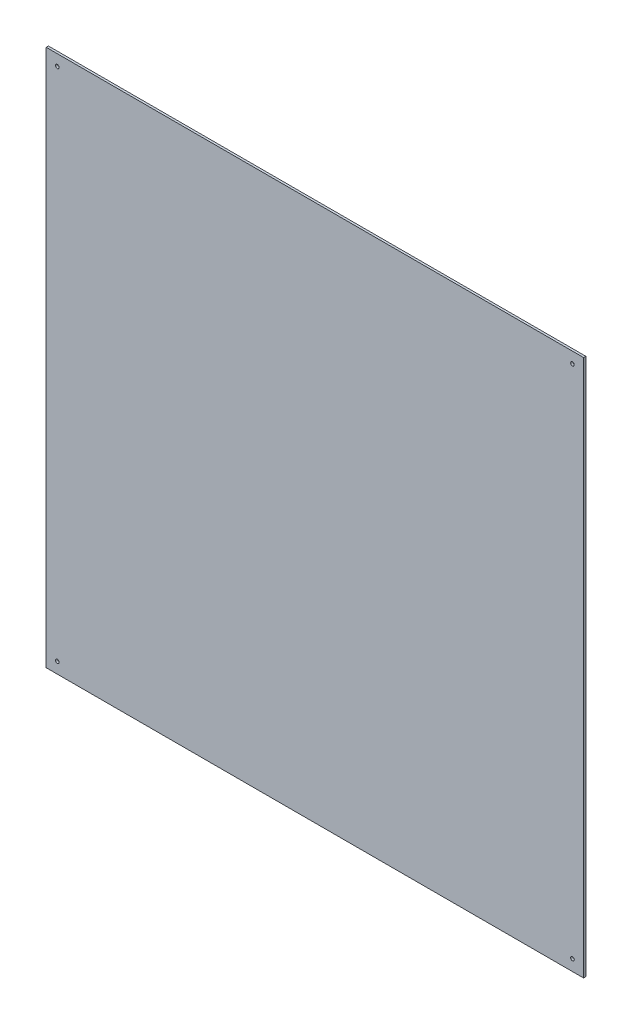
ISO-10303-21;
HEADER;
FILE_DESCRIPTION(('STEP AP214'),'2;1');
FILE_NAME('part.step','',(''),(''),'','','');
FILE_SCHEMA(('AUTOMOTIVE_DESIGN { 1 0 10303 214 1 1 1 1 }'));
ENDSEC;
DATA;
#1=APPLICATION_CONTEXT('core data for automotive mechanical design processes');
#2=APPLICATION_PROTOCOL_DEFINITION('international standard','automotive_design',2000,#1);
#3=PRODUCT_CONTEXT('',#1,'mechanical');
#4=PRODUCT('Part','Part','',(#3));
#5=PRODUCT_RELATED_PRODUCT_CATEGORY('part','',(#4));
#6=PRODUCT_DEFINITION_FORMATION('','',#4);
#7=PRODUCT_DEFINITION_CONTEXT('part definition',#1,'design');
#8=PRODUCT_DEFINITION('design','',#6,#7);
#9=PRODUCT_DEFINITION_SHAPE('','',#8);
#10=(LENGTH_UNIT() NAMED_UNIT(*) SI_UNIT(.MILLI.,.METRE.));
#11=(NAMED_UNIT(*) PLANE_ANGLE_UNIT() SI_UNIT($,.RADIAN.));
#12=(NAMED_UNIT(*) SI_UNIT($,.STERADIAN.) SOLID_ANGLE_UNIT());
#13=UNCERTAINTY_MEASURE_WITH_UNIT(LENGTH_MEASURE(1.E-05),#10,'distance_accuracy_value','');
#14=(GEOMETRIC_REPRESENTATION_CONTEXT(3) GLOBAL_UNCERTAINTY_ASSIGNED_CONTEXT((#13)) GLOBAL_UNIT_ASSIGNED_CONTEXT((#10,
#11,#12)) REPRESENTATION_CONTEXT('',''));
#15=CARTESIAN_POINT('',(0.,0.,0.));
#16=DIRECTION('',(0.,0.,1.));
#17=DIRECTION('',(1.,0.,0.));
#18=AXIS2_PLACEMENT_3D('',#15,#16,#17);
#19=CARTESIAN_POINT('',(-579.999999999999,-580.,0.));
#20=DIRECTION('',(0.,0.,1.));
#21=DIRECTION('',(1.,0.,0.));
#22=AXIS2_PLACEMENT_3D('',#19,#20,#21);
#23=CYLINDRICAL_SURFACE('',#22,4.05000000000001);
#24=CARTESIAN_POINT('',(-579.999999999999,-580.,0.));
#25=DIRECTION('',(0.,0.,1.));
#26=DIRECTION('',(1.,0.,0.));
#27=AXIS2_PLACEMENT_3D('',#24,#25,#26);
#28=CIRCLE('',#27,4.05000000000001);
#29=CARTESIAN_POINT('',(-575.949999999999,-580.,0.));
#30=VERTEX_POINT('',#29);
#31=EDGE_CURVE('E43',#30,#30,#28,.T.);
#32=ORIENTED_EDGE('',*,*,#31,.F.);
#33=EDGE_LOOP('',(#32));
#34=FACE_BOUND('',#33,.T.);
#35=CARTESIAN_POINT('',(-579.999999999999,-580.,5.));
#36=DIRECTION('',(0.,0.,1.));
#37=DIRECTION('',(1.,0.,0.));
#38=AXIS2_PLACEMENT_3D('',#35,#36,#37);
#39=CIRCLE('',#38,4.05000000000001);
#40=CARTESIAN_POINT('',(-575.949999999999,-580.,5.));
#41=VERTEX_POINT('',#40);
#42=EDGE_CURVE('E11',#41,#41,#39,.T.);
#43=ORIENTED_EDGE('',*,*,#42,.T.);
#44=EDGE_LOOP('',(#43));
#45=FACE_BOUND('',#44,.T.);
#46=ADVANCED_FACE('F35',(#34,#45),#23,.F.);
#47=CARTESIAN_POINT('',(580.000000000001,-580.,0.));
#48=DIRECTION('',(0.,0.,1.));
#49=DIRECTION('',(1.,0.,0.));
#50=AXIS2_PLACEMENT_3D('',#47,#48,#49);
#51=CYLINDRICAL_SURFACE('',#50,4.05000000000001);
#52=CARTESIAN_POINT('',(580.000000000001,-580.,0.));
#53=DIRECTION('',(0.,0.,1.));
#54=DIRECTION('',(1.,0.,0.));
#55=AXIS2_PLACEMENT_3D('',#52,#53,#54);
#56=CIRCLE('',#55,4.05000000000001);
#57=CARTESIAN_POINT('',(584.050000000001,-580.,0.));
#58=VERTEX_POINT('',#57);
#59=EDGE_CURVE('E113',#58,#58,#56,.T.);
#60=ORIENTED_EDGE('',*,*,#59,.F.);
#61=EDGE_LOOP('',(#60));
#62=FACE_BOUND('',#61,.T.);
#63=CARTESIAN_POINT('',(580.000000000001,-580.,5.));
#64=DIRECTION('',(0.,0.,1.));
#65=DIRECTION('',(1.,0.,0.));
#66=AXIS2_PLACEMENT_3D('',#63,#64,#65);
#67=CIRCLE('',#66,4.05000000000001);
#68=CARTESIAN_POINT('',(584.050000000001,-580.,5.));
#69=VERTEX_POINT('',#68);
#70=EDGE_CURVE('E116',#69,#69,#67,.T.);
#71=ORIENTED_EDGE('',*,*,#70,.T.);
#72=EDGE_LOOP('',(#71));
#73=FACE_BOUND('',#72,.T.);
#74=ADVANCED_FACE('F125',(#62,#73),#51,.F.);
#75=CARTESIAN_POINT('',(-605.,605.,5.));
#76=DIRECTION('',(1.,0.,0.));
#77=DIRECTION('',(0.,0.,-1.));
#78=AXIS2_PLACEMENT_3D('',#75,#76,#77);
#79=PLANE('',#78);
#80=DIRECTION('',(0.,-1.,0.));
#81=VECTOR('',#80,1.);
#82=CARTESIAN_POINT('',(-605.,605.,0.));
#83=LINE('',#82,#81);
#84=CARTESIAN_POINT('',(-605.,605.,0.));
#85=VERTEX_POINT('',#84);
#86=CARTESIAN_POINT('',(-605.,-605.,0.));
#87=VERTEX_POINT('',#86);
#88=EDGE_CURVE('E103',#85,#87,#83,.T.);
#89=ORIENTED_EDGE('',*,*,#88,.T.);
#90=DIRECTION('',(0.,0.,-1.));
#91=VECTOR('',#90,1.);
#92=CARTESIAN_POINT('',(-605.,-605.,5.));
#93=LINE('',#92,#91);
#94=CARTESIAN_POINT('',(-605.,-605.,5.));
#95=VERTEX_POINT('',#94);
#96=EDGE_CURVE('E94',#95,#87,#93,.T.);
#97=ORIENTED_EDGE('',*,*,#96,.F.);
#98=DIRECTION('',(0.,-1.,0.));
#99=VECTOR('',#98,1.);
#100=CARTESIAN_POINT('',(-605.,605.,5.));
#101=LINE('',#100,#99);
#102=CARTESIAN_POINT('',(-605.,605.,5.));
#103=VERTEX_POINT('',#102);
#104=EDGE_CURVE('E88',#103,#95,#101,.T.);
#105=ORIENTED_EDGE('',*,*,#104,.F.);
#106=DIRECTION('',(0.,0.,-1.));
#107=VECTOR('',#106,1.);
#108=CARTESIAN_POINT('',(-605.,605.,5.));
#109=LINE('',#108,#107);
#110=EDGE_CURVE('E99',#103,#85,#109,.T.);
#111=ORIENTED_EDGE('',*,*,#110,.T.);
#112=EDGE_LOOP('',(#89,#97,#105,#111));
#113=FACE_BOUND('',#112,.T.);
#114=ADVANCED_FACE('F149',(#113),#79,.F.);
#115=CARTESIAN_POINT('',(-605.,-605.,5.));
#116=DIRECTION('',(0.,1.,0.));
#117=DIRECTION('',(-1.,0.,0.));
#118=AXIS2_PLACEMENT_3D('',#115,#116,#117);
#119=PLANE('',#118);
#120=DIRECTION('',(1.,0.,0.));
#121=VECTOR('',#120,1.);
#122=CARTESIAN_POINT('',(-605.,-605.,0.));
#123=LINE('',#122,#121);
#124=CARTESIAN_POINT('',(605.,-605.,0.));
#125=VERTEX_POINT('',#124);
#126=EDGE_CURVE('E93',#87,#125,#123,.T.);
#127=ORIENTED_EDGE('',*,*,#126,.T.);
#128=DIRECTION('',(0.,0.,-1.));
#129=VECTOR('',#128,1.);
#130=CARTESIAN_POINT('',(605.,-605.,5.));
#131=LINE('',#130,#129);
#132=CARTESIAN_POINT('',(605.,-605.,5.));
#133=VERTEX_POINT('',#132);
#134=EDGE_CURVE('E91',#133,#125,#131,.T.);
#135=ORIENTED_EDGE('',*,*,#134,.F.);
#136=DIRECTION('',(1.,0.,0.));
#137=VECTOR('',#136,1.);
#138=CARTESIAN_POINT('',(-605.,-605.,5.));
#139=LINE('',#138,#137);
#140=EDGE_CURVE('E82',#95,#133,#139,.T.);
#141=ORIENTED_EDGE('',*,*,#140,.F.);
#142=ORIENTED_EDGE('',*,*,#96,.T.);
#143=EDGE_LOOP('',(#127,#135,#141,#142));
#144=FACE_BOUND('',#143,.T.);
#145=ADVANCED_FACE('F92',(#144),#119,.F.);
#146=CARTESIAN_POINT('',(605.,605.,5.));
#147=DIRECTION('',(-1.,0.,0.));
#148=DIRECTION('',(0.,-1.,0.));
#149=AXIS2_PLACEMENT_3D('',#146,#147,#148);
#150=PLANE('',#149);
#151=DIRECTION('',(0.,1.,0.));
#152=VECTOR('',#151,1.);
#153=CARTESIAN_POINT('',(605.,605.,0.));
#154=LINE('',#153,#152);
#155=CARTESIAN_POINT('',(605.,605.,0.));
#156=VERTEX_POINT('',#155);
#157=EDGE_CURVE('E68',#125,#156,#154,.T.);
#158=ORIENTED_EDGE('',*,*,#157,.T.);
#159=DIRECTION('',(0.,0.,-1.));
#160=VECTOR('',#159,1.);
#161=CARTESIAN_POINT('',(605.,605.,5.));
#162=LINE('',#161,#160);
#163=CARTESIAN_POINT('',(605.,605.,5.));
#164=VERTEX_POINT('',#163);
#165=EDGE_CURVE('E95',#164,#156,#162,.T.);
#166=ORIENTED_EDGE('',*,*,#165,.F.);
#167=DIRECTION('',(0.,1.,0.));
#168=VECTOR('',#167,1.);
#169=CARTESIAN_POINT('',(605.,605.,5.));
#170=LINE('',#169,#168);
#171=EDGE_CURVE('E86',#133,#164,#170,.T.);
#172=ORIENTED_EDGE('',*,*,#171,.F.);
#173=ORIENTED_EDGE('',*,*,#134,.T.);
#174=EDGE_LOOP('',(#158,#166,#172,#173));
#175=FACE_BOUND('',#174,.T.);
#176=ADVANCED_FACE('F97',(#175),#150,.F.);
#177=CARTESIAN_POINT('',(-605.,605.,5.));
#178=DIRECTION('',(0.,-1.,0.));
#179=DIRECTION('',(1.,0.,0.));
#180=AXIS2_PLACEMENT_3D('',#177,#178,#179);
#181=PLANE('',#180);
#182=DIRECTION('',(-1.,0.,0.));
#183=VECTOR('',#182,1.);
#184=CARTESIAN_POINT('',(-605.,605.,0.));
#185=LINE('',#184,#183);
#186=EDGE_CURVE('E74',#156,#85,#185,.T.);
#187=ORIENTED_EDGE('',*,*,#186,.T.);
#188=ORIENTED_EDGE('',*,*,#110,.F.);
#189=DIRECTION('',(-1.,0.,0.));
#190=VECTOR('',#189,1.);
#191=CARTESIAN_POINT('',(-605.,605.,5.));
#192=LINE('',#191,#190);
#193=EDGE_CURVE('E51',#164,#103,#192,.T.);
#194=ORIENTED_EDGE('',*,*,#193,.F.);
#195=ORIENTED_EDGE('',*,*,#165,.T.);
#196=EDGE_LOOP('',(#187,#188,#194,#195));
#197=FACE_BOUND('',#196,.T.);
#198=ADVANCED_FACE('F129',(#197),#181,.F.);
#199=CARTESIAN_POINT('',(0.,0.,5.));
#200=DIRECTION('',(0.,0.,1.));
#201=DIRECTION('',(1.,0.,0.));
#202=AXIS2_PLACEMENT_3D('',#199,#200,#201);
#203=PLANE('',#202);
#204=CARTESIAN_POINT('',(-580.,580.,5.));
#205=DIRECTION('',(0.,0.,1.));
#206=DIRECTION('',(1.,0.,0.));
#207=AXIS2_PLACEMENT_3D('',#204,#205,#206);
#208=CIRCLE('',#207,4.05000000000001);
#209=CARTESIAN_POINT('',(-575.95,580.,5.));
#210=VERTEX_POINT('',#209);
#211=EDGE_CURVE('E220',#210,#210,#208,.T.);
#212=ORIENTED_EDGE('',*,*,#211,.F.);
#213=EDGE_LOOP('',(#212));
#214=FACE_BOUND('',#213,.T.);
#215=CARTESIAN_POINT('',(580.,580.,5.));
#216=DIRECTION('',(0.,0.,1.));
#217=DIRECTION('',(1.,0.,0.));
#218=AXIS2_PLACEMENT_3D('',#215,#216,#217);
#219=CIRCLE('',#218,4.05000000000001);
#220=CARTESIAN_POINT('',(584.05,580.,5.));
#221=VERTEX_POINT('',#220);
#222=EDGE_CURVE('E221',#221,#221,#219,.T.);
#223=ORIENTED_EDGE('',*,*,#222,.F.);
#224=EDGE_LOOP('',(#223));
#225=FACE_BOUND('',#224,.T.);
#226=ORIENTED_EDGE('',*,*,#104,.T.);
#227=ORIENTED_EDGE('',*,*,#140,.T.);
#228=ORIENTED_EDGE('',*,*,#171,.T.);
#229=ORIENTED_EDGE('',*,*,#193,.T.);
#230=EDGE_LOOP('',(#226,#227,#228,#229));
#231=FACE_BOUND('',#230,.T.);
#232=ORIENTED_EDGE('',*,*,#70,.F.);
#233=EDGE_LOOP('',(#232));
#234=FACE_BOUND('',#233,.T.);
#235=ORIENTED_EDGE('',*,*,#42,.F.);
#236=EDGE_LOOP('',(#235));
#237=FACE_BOUND('',#236,.T.);
#238=ADVANCED_FACE('F83',(#214,#225,#231,#234,#237),#203,.T.);
#239=CARTESIAN_POINT('',(0.,0.,0.));
#240=DIRECTION('',(0.,0.,1.));
#241=DIRECTION('',(1.,0.,0.));
#242=AXIS2_PLACEMENT_3D('',#239,#240,#241);
#243=PLANE('',#242);
#244=CARTESIAN_POINT('',(-580.,580.,0.));
#245=DIRECTION('',(0.,0.,1.));
#246=DIRECTION('',(1.,0.,0.));
#247=AXIS2_PLACEMENT_3D('',#244,#245,#246);
#248=CIRCLE('',#247,4.05000000000001);
#249=CARTESIAN_POINT('',(-575.95,580.,0.));
#250=VERTEX_POINT('',#249);
#251=EDGE_CURVE('E218',#250,#250,#248,.T.);
#252=ORIENTED_EDGE('',*,*,#251,.T.);
#253=EDGE_LOOP('',(#252));
#254=FACE_BOUND('',#253,.T.);
#255=CARTESIAN_POINT('',(580.,580.,0.));
#256=DIRECTION('',(0.,0.,1.));
#257=DIRECTION('',(1.,0.,0.));
#258=AXIS2_PLACEMENT_3D('',#255,#256,#257);
#259=CIRCLE('',#258,4.05000000000001);
#260=CARTESIAN_POINT('',(584.05,580.,0.));
#261=VERTEX_POINT('',#260);
#262=EDGE_CURVE('E106',#261,#261,#259,.T.);
#263=ORIENTED_EDGE('',*,*,#262,.T.);
#264=EDGE_LOOP('',(#263));
#265=FACE_BOUND('',#264,.T.);
#266=ORIENTED_EDGE('',*,*,#88,.F.);
#267=ORIENTED_EDGE('',*,*,#186,.F.);
#268=ORIENTED_EDGE('',*,*,#157,.F.);
#269=ORIENTED_EDGE('',*,*,#126,.F.);
#270=EDGE_LOOP('',(#266,#267,#268,#269));
#271=FACE_BOUND('',#270,.T.);
#272=ORIENTED_EDGE('',*,*,#59,.T.);
#273=EDGE_LOOP('',(#272));
#274=FACE_BOUND('',#273,.T.);
#275=ORIENTED_EDGE('',*,*,#31,.T.);
#276=EDGE_LOOP('',(#275));
#277=FACE_BOUND('',#276,.T.);
#278=ADVANCED_FACE('F121',(#254,#265,#271,#274,#277),#243,.F.);
#279=CARTESIAN_POINT('',(580.,580.,0.));
#280=DIRECTION('',(0.,0.,1.));
#281=DIRECTION('',(1.,0.,0.));
#282=AXIS2_PLACEMENT_3D('',#279,#280,#281);
#283=CYLINDRICAL_SURFACE('',#282,4.05000000000001);
#284=ORIENTED_EDGE('',*,*,#262,.F.);
#285=EDGE_LOOP('',(#284));
#286=FACE_BOUND('',#285,.T.);
#287=ORIENTED_EDGE('',*,*,#222,.T.);
#288=EDGE_LOOP('',(#287));
#289=FACE_BOUND('',#288,.T.);
#290=ADVANCED_FACE('F136',(#286,#289),#283,.F.);
#291=CARTESIAN_POINT('',(-580.,580.,0.));
#292=DIRECTION('',(0.,0.,1.));
#293=DIRECTION('',(1.,0.,0.));
#294=AXIS2_PLACEMENT_3D('',#291,#292,#293);
#295=CYLINDRICAL_SURFACE('',#294,4.05000000000001);
#296=ORIENTED_EDGE('',*,*,#251,.F.);
#297=EDGE_LOOP('',(#296));
#298=FACE_BOUND('',#297,.T.);
#299=ORIENTED_EDGE('',*,*,#211,.T.);
#300=EDGE_LOOP('',(#299));
#301=FACE_BOUND('',#300,.T.);
#302=ADVANCED_FACE('F187',(#298,#301),#295,.F.);
#303=CLOSED_SHELL('',(#46,#74,#114,#145,#176,#198,#238,#278,#290,#302));
#304=MANIFOLD_SOLID_BREP('B2',#303);
#305=ADVANCED_BREP_SHAPE_REPRESENTATION('',(#18,#304),#14);
#306=SHAPE_DEFINITION_REPRESENTATION(#9,#305);
ENDSEC;
END-ISO-10303-21;
